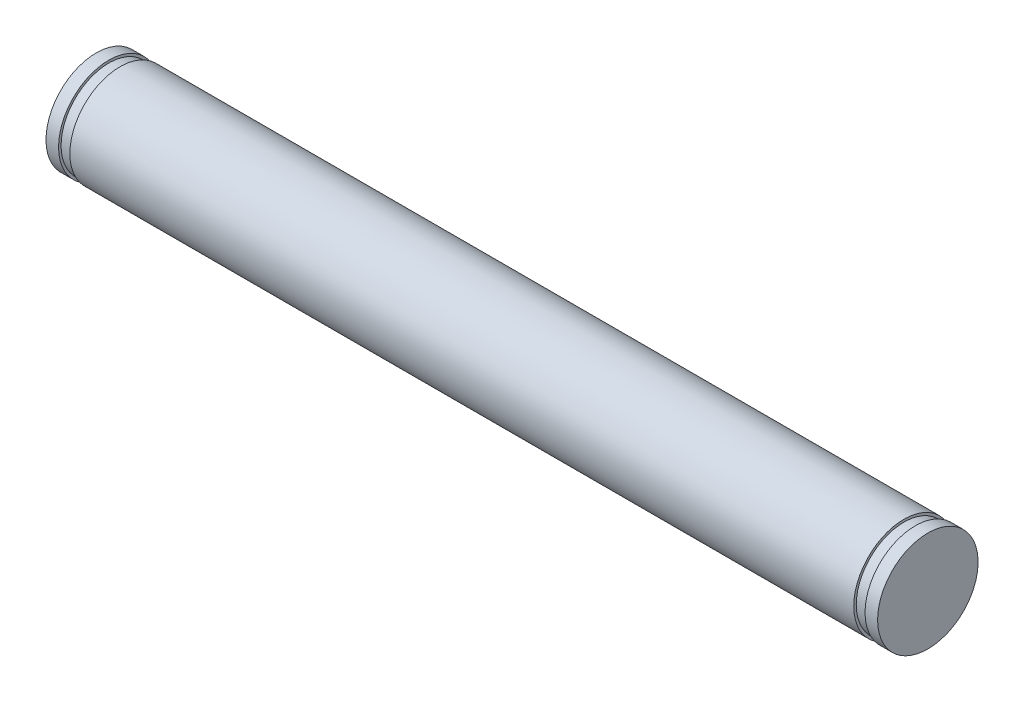
ISO-10303-21;
HEADER;
FILE_DESCRIPTION(('STEP AP214'),'2;1');
FILE_NAME('part.step','',(''),(''),'','','');
FILE_SCHEMA(('AUTOMOTIVE_DESIGN { 1 0 10303 214 1 1 1 1 }'));
ENDSEC;
DATA;
#1=APPLICATION_CONTEXT('core data for automotive mechanical design processes');
#2=APPLICATION_PROTOCOL_DEFINITION('international standard','automotive_design',2000,#1);
#3=PRODUCT_CONTEXT('',#1,'mechanical');
#4=PRODUCT('Part','Part','',(#3));
#5=PRODUCT_RELATED_PRODUCT_CATEGORY('part','',(#4));
#6=PRODUCT_DEFINITION_FORMATION('','',#4);
#7=PRODUCT_DEFINITION_CONTEXT('part definition',#1,'design');
#8=PRODUCT_DEFINITION('design','',#6,#7);
#9=PRODUCT_DEFINITION_SHAPE('','',#8);
#10=(LENGTH_UNIT() NAMED_UNIT(*) SI_UNIT(.MILLI.,.METRE.));
#11=(NAMED_UNIT(*) PLANE_ANGLE_UNIT() SI_UNIT($,.RADIAN.));
#12=(NAMED_UNIT(*) SI_UNIT($,.STERADIAN.) SOLID_ANGLE_UNIT());
#13=UNCERTAINTY_MEASURE_WITH_UNIT(LENGTH_MEASURE(1.E-05),#10,'distance_accuracy_value','');
#14=(GEOMETRIC_REPRESENTATION_CONTEXT(3) GLOBAL_UNCERTAINTY_ASSIGNED_CONTEXT((#13)) GLOBAL_UNIT_ASSIGNED_CONTEXT((#10,
#11,#12)) REPRESENTATION_CONTEXT('',''));
#15=CARTESIAN_POINT('',(0.,0.,0.));
#16=DIRECTION('',(0.,0.,1.));
#17=DIRECTION('',(1.,0.,0.));
#18=AXIS2_PLACEMENT_3D('',#15,#16,#17);
#19=CARTESIAN_POINT('',(-1.9,0.,0.));
#20=DIRECTION('',(1.,0.,0.));
#21=DIRECTION('',(0.,0.,-1.));
#22=AXIS2_PLACEMENT_3D('',#19,#20,#21);
#23=PLANE('',#22);
#24=CARTESIAN_POINT('',(-1.9,0.,0.));
#25=DIRECTION('',(-1.,0.,0.));
#26=DIRECTION('',(0.,0.,1.));
#27=AXIS2_PLACEMENT_3D('',#24,#25,#26);
#28=CIRCLE('',#27,4.);
#29=CARTESIAN_POINT('',(-1.9,0.,4.));
#30=VERTEX_POINT('',#29);
#31=EDGE_CURVE('E69',#30,#30,#28,.T.);
#32=ORIENTED_EDGE('',*,*,#31,.T.);
#33=EDGE_LOOP('',(#32));
#34=FACE_BOUND('',#33,.T.);
#35=ADVANCED_FACE('F34',(#34),#23,.F.);
#36=CARTESIAN_POINT('',(64.3,0.,0.));
#37=DIRECTION('',(1.,0.,0.));
#38=DIRECTION('',(0.,0.,-1.));
#39=AXIS2_PLACEMENT_3D('',#36,#37,#38);
#40=PLANE('',#39);
#41=CARTESIAN_POINT('',(64.3,0.,0.));
#42=DIRECTION('',(-1.,0.,0.));
#43=DIRECTION('',(0.,0.,1.));
#44=AXIS2_PLACEMENT_3D('',#41,#42,#43);
#45=CIRCLE('',#44,4.);
#46=CARTESIAN_POINT('',(64.3,0.,4.));
#47=VERTEX_POINT('',#46);
#48=EDGE_CURVE('E10',#47,#47,#45,.T.);
#49=ORIENTED_EDGE('',*,*,#48,.F.);
#50=EDGE_LOOP('',(#49));
#51=FACE_BOUND('',#50,.T.);
#52=ADVANCED_FACE('F135',(#51),#40,.T.);
#53=CARTESIAN_POINT('',(0.,0.,0.));
#54=DIRECTION('',(-1.,0.,0.));
#55=DIRECTION('',(0.,0.,1.));
#56=AXIS2_PLACEMENT_3D('',#53,#54,#55);
#57=CYLINDRICAL_SURFACE('',#56,4.);
#58=ORIENTED_EDGE('',*,*,#48,.T.);
#59=EDGE_LOOP('',(#58));
#60=FACE_BOUND('',#59,.T.);
#61=CARTESIAN_POINT('',(63.3,0.,0.));
#62=DIRECTION('',(-1.,0.,0.));
#63=DIRECTION('',(0.,0.,1.));
#64=AXIS2_PLACEMENT_3D('',#61,#62,#63);
#65=CIRCLE('',#64,4.);
#66=CARTESIAN_POINT('',(63.3,0.,4.));
#67=VERTEX_POINT('',#66);
#68=EDGE_CURVE('E41',#67,#67,#65,.T.);
#69=ORIENTED_EDGE('',*,*,#68,.F.);
#70=EDGE_LOOP('',(#69));
#71=FACE_BOUND('',#70,.T.);
#72=ADVANCED_FACE('F133',(#60,#71),#57,.T.);
#73=CARTESIAN_POINT('',(63.3,0.,0.));
#74=DIRECTION('',(-1.,0.,0.));
#75=DIRECTION('',(0.,0.,1.));
#76=AXIS2_PLACEMENT_3D('',#73,#74,#75);
#77=PLANE('',#76);
#78=ORIENTED_EDGE('',*,*,#68,.T.);
#79=EDGE_LOOP('',(#78));
#80=FACE_BOUND('',#79,.T.);
#81=CARTESIAN_POINT('',(63.3,0.,0.));
#82=DIRECTION('',(-1.,0.,0.));
#83=DIRECTION('',(0.,0.,1.));
#84=AXIS2_PLACEMENT_3D('',#81,#82,#83);
#85=CIRCLE('',#84,3.8);
#86=CARTESIAN_POINT('',(63.3,0.,3.8));
#87=VERTEX_POINT('',#86);
#88=EDGE_CURVE('E45',#87,#87,#85,.T.);
#89=ORIENTED_EDGE('',*,*,#88,.F.);
#90=EDGE_LOOP('',(#89));
#91=FACE_BOUND('',#90,.T.);
#92=ADVANCED_FACE('F129',(#80,#91),#77,.T.);
#93=CARTESIAN_POINT('',(0.,0.,0.));
#94=DIRECTION('',(-1.,0.,0.));
#95=DIRECTION('',(0.,0.,1.));
#96=AXIS2_PLACEMENT_3D('',#93,#94,#95);
#97=CYLINDRICAL_SURFACE('',#96,3.8);
#98=ORIENTED_EDGE('',*,*,#88,.T.);
#99=EDGE_LOOP('',(#98));
#100=FACE_BOUND('',#99,.T.);
#101=CARTESIAN_POINT('',(62.4,0.,0.));
#102=DIRECTION('',(-1.,0.,0.));
#103=DIRECTION('',(0.,0.,1.));
#104=AXIS2_PLACEMENT_3D('',#101,#102,#103);
#105=CIRCLE('',#104,3.8);
#106=CARTESIAN_POINT('',(62.4,0.,3.8));
#107=VERTEX_POINT('',#106);
#108=EDGE_CURVE('E49',#107,#107,#105,.T.);
#109=ORIENTED_EDGE('',*,*,#108,.F.);
#110=EDGE_LOOP('',(#109));
#111=FACE_BOUND('',#110,.T.);
#112=ADVANCED_FACE('F125',(#100,#111),#97,.T.);
#113=CARTESIAN_POINT('',(62.4,0.,0.));
#114=DIRECTION('',(-1.,0.,0.));
#115=DIRECTION('',(0.,0.,1.));
#116=AXIS2_PLACEMENT_3D('',#113,#114,#115);
#117=PLANE('',#116);
#118=CARTESIAN_POINT('',(62.4,0.,0.));
#119=DIRECTION('',(-1.,0.,0.));
#120=DIRECTION('',(0.,0.,1.));
#121=AXIS2_PLACEMENT_3D('',#118,#119,#120);
#122=CIRCLE('',#121,4.);
#123=CARTESIAN_POINT('',(62.4,0.,4.));
#124=VERTEX_POINT('',#123);
#125=EDGE_CURVE('E54',#124,#124,#122,.T.);
#126=ORIENTED_EDGE('',*,*,#125,.F.);
#127=EDGE_LOOP('',(#126));
#128=FACE_BOUND('',#127,.T.);
#129=ORIENTED_EDGE('',*,*,#108,.T.);
#130=EDGE_LOOP('',(#129));
#131=FACE_BOUND('',#130,.T.);
#132=ADVANCED_FACE('F121',(#128,#131),#117,.F.);
#133=CARTESIAN_POINT('',(0.,0.,0.));
#134=DIRECTION('',(-1.,0.,0.));
#135=DIRECTION('',(0.,0.,1.));
#136=AXIS2_PLACEMENT_3D('',#133,#134,#135);
#137=CYLINDRICAL_SURFACE('',#136,4.);
#138=ORIENTED_EDGE('',*,*,#125,.T.);
#139=EDGE_LOOP('',(#138));
#140=FACE_BOUND('',#139,.T.);
#141=CARTESIAN_POINT('',(0.,0.,0.));
#142=DIRECTION('',(-1.,0.,0.));
#143=DIRECTION('',(0.,0.,1.));
#144=AXIS2_PLACEMENT_3D('',#141,#142,#143);
#145=CIRCLE('',#144,4.);
#146=CARTESIAN_POINT('',(0.,0.,4.));
#147=VERTEX_POINT('',#146);
#148=EDGE_CURVE('E57',#147,#147,#145,.T.);
#149=ORIENTED_EDGE('',*,*,#148,.F.);
#150=EDGE_LOOP('',(#149));
#151=FACE_BOUND('',#150,.T.);
#152=ADVANCED_FACE('F117',(#140,#151),#137,.T.);
#153=CARTESIAN_POINT('',(0.,0.,0.));
#154=DIRECTION('',(-1.,0.,0.));
#155=DIRECTION('',(0.,0.,1.));
#156=AXIS2_PLACEMENT_3D('',#153,#154,#155);
#157=PLANE('',#156);
#158=ORIENTED_EDGE('',*,*,#148,.T.);
#159=EDGE_LOOP('',(#158));
#160=FACE_BOUND('',#159,.T.);
#161=CARTESIAN_POINT('',(0.,0.,0.));
#162=DIRECTION('',(-1.,0.,0.));
#163=DIRECTION('',(0.,0.,1.));
#164=AXIS2_PLACEMENT_3D('',#161,#162,#163);
#165=CIRCLE('',#164,3.8);
#166=CARTESIAN_POINT('',(0.,0.,3.8));
#167=VERTEX_POINT('',#166);
#168=EDGE_CURVE('E60',#167,#167,#165,.T.);
#169=ORIENTED_EDGE('',*,*,#168,.F.);
#170=EDGE_LOOP('',(#169));
#171=FACE_BOUND('',#170,.T.);
#172=ADVANCED_FACE('F113',(#160,#171),#157,.T.);
#173=CARTESIAN_POINT('',(0.,0.,0.));
#174=DIRECTION('',(-1.,0.,0.));
#175=DIRECTION('',(0.,0.,1.));
#176=AXIS2_PLACEMENT_3D('',#173,#174,#175);
#177=CYLINDRICAL_SURFACE('',#176,3.8);
#178=CARTESIAN_POINT('',(-0.9,0.,0.));
#179=DIRECTION('',(-1.,0.,0.));
#180=DIRECTION('',(0.,0.,1.));
#181=AXIS2_PLACEMENT_3D('',#178,#179,#180);
#182=CIRCLE('',#181,3.8);
#183=CARTESIAN_POINT('',(-0.9,0.,3.8));
#184=VERTEX_POINT('',#183);
#185=EDGE_CURVE('E63',#184,#184,#182,.T.);
#186=ORIENTED_EDGE('',*,*,#185,.F.);
#187=EDGE_LOOP('',(#186));
#188=FACE_BOUND('',#187,.T.);
#189=ORIENTED_EDGE('',*,*,#168,.T.);
#190=EDGE_LOOP('',(#189));
#191=FACE_BOUND('',#190,.T.);
#192=ADVANCED_FACE('F109',(#188,#191),#177,.T.);
#193=CARTESIAN_POINT('',(-0.9,0.,0.));
#194=DIRECTION('',(-1.,0.,0.));
#195=DIRECTION('',(0.,0.,1.));
#196=AXIS2_PLACEMENT_3D('',#193,#194,#195);
#197=PLANE('',#196);
#198=CARTESIAN_POINT('',(-0.9,0.,0.));
#199=DIRECTION('',(-1.,0.,0.));
#200=DIRECTION('',(0.,0.,1.));
#201=AXIS2_PLACEMENT_3D('',#198,#199,#200);
#202=CIRCLE('',#201,4.);
#203=CARTESIAN_POINT('',(-0.9,0.,4.));
#204=VERTEX_POINT('',#203);
#205=EDGE_CURVE('E66',#204,#204,#202,.T.);
#206=ORIENTED_EDGE('',*,*,#205,.F.);
#207=EDGE_LOOP('',(#206));
#208=FACE_BOUND('',#207,.T.);
#209=ORIENTED_EDGE('',*,*,#185,.T.);
#210=EDGE_LOOP('',(#209));
#211=FACE_BOUND('',#210,.T.);
#212=ADVANCED_FACE('F105',(#208,#211),#197,.F.);
#213=CARTESIAN_POINT('',(0.,0.,0.));
#214=DIRECTION('',(-1.,0.,0.));
#215=DIRECTION('',(0.,0.,1.));
#216=AXIS2_PLACEMENT_3D('',#213,#214,#215);
#217=CYLINDRICAL_SURFACE('',#216,4.);
#218=ORIENTED_EDGE('',*,*,#31,.F.);
#219=EDGE_LOOP('',(#218));
#220=FACE_BOUND('',#219,.T.);
#221=ORIENTED_EDGE('',*,*,#205,.T.);
#222=EDGE_LOOP('',(#221));
#223=FACE_BOUND('',#222,.T.);
#224=ADVANCED_FACE('F103',(#220,#223),#217,.T.);
#225=CLOSED_SHELL('',(#35,#52,#72,#92,#112,#132,#152,#172,#192,#212,#224));
#226=CARTESIAN_POINT('',(62.4,0.,0.));
#227=DIRECTION('',(-1.,0.,0.));
#228=DIRECTION('',(0.,0.,1.));
#229=AXIS2_PLACEMENT_3D('',#226,#227,#228);
#230=PLANE('',#229);
#231=CARTESIAN_POINT('',(62.4,0.,0.));
#232=DIRECTION('',(-1.,0.,0.));
#233=DIRECTION('',(0.,0.,1.));
#234=AXIS2_PLACEMENT_3D('',#231,#232,#233);
#235=CIRCLE('',#234,1.78150672782901);
#236=CARTESIAN_POINT('',(62.4,0.,1.78150672782901));
#237=VERTEX_POINT('',#236);
#238=EDGE_CURVE('E78',#237,#237,#235,.T.);
#239=ORIENTED_EDGE('',*,*,#238,.T.);
#240=EDGE_LOOP('',(#239));
#241=FACE_BOUND('',#240,.T.);
#242=CARTESIAN_POINT('',(62.4,0.,0.));
#243=DIRECTION('',(-1.,0.,0.));
#244=DIRECTION('',(0.,0.,1.));
#245=AXIS2_PLACEMENT_3D('',#242,#243,#244);
#246=CIRCLE('',#245,1.68057150333984);
#247=CARTESIAN_POINT('',(62.4,0.,1.68057150333984));
#248=VERTEX_POINT('',#247);
#249=EDGE_CURVE('E72',#248,#248,#246,.T.);
#250=ORIENTED_EDGE('',*,*,#249,.F.);
#251=EDGE_LOOP('',(#250));
#252=FACE_BOUND('',#251,.T.);
#253=ADVANCED_FACE('F82',(#241,#252),#230,.T.);
#254=CARTESIAN_POINT('',(62.4,0.,0.));
#255=DIRECTION('',(-1.,0.,0.));
#256=DIRECTION('',(0.,0.,1.));
#257=AXIS2_PLACEMENT_3D('',#254,#255,#256);
#258=CONICAL_SURFACE('',#257,1.68057150333984,0.349897397677372);
#259=CARTESIAN_POINT('',(62.1233986218421,0.,0.));
#260=DIRECTION('',(-1.,0.,0.));
#261=DIRECTION('',(0.,0.,1.));
#262=AXIS2_PLACEMENT_3D('',#259,#260,#261);
#263=CIRCLE('',#262,1.78150672782901);
#264=CARTESIAN_POINT('',(62.1233986218421,0.,1.78150672782901));
#265=VERTEX_POINT('',#264);
#266=EDGE_CURVE('E75',#265,#265,#263,.T.);
#267=ORIENTED_EDGE('',*,*,#266,.F.);
#268=EDGE_LOOP('',(#267));
#269=FACE_BOUND('',#268,.T.);
#270=ORIENTED_EDGE('',*,*,#249,.T.);
#271=EDGE_LOOP('',(#270));
#272=FACE_BOUND('',#271,.T.);
#273=ADVANCED_FACE('F88',(#269,#272),#258,.T.);
#274=CARTESIAN_POINT('',(0.,0.,0.));
#275=DIRECTION('',(-1.,0.,0.));
#276=DIRECTION('',(0.,0.,1.));
#277=AXIS2_PLACEMENT_3D('',#274,#275,#276);
#278=CYLINDRICAL_SURFACE('',#277,1.78150672782901);
#279=ORIENTED_EDGE('',*,*,#238,.F.);
#280=EDGE_LOOP('',(#279));
#281=FACE_BOUND('',#280,.T.);
#282=ORIENTED_EDGE('',*,*,#266,.T.);
#283=EDGE_LOOP('',(#282));
#284=FACE_BOUND('',#283,.T.);
#285=ADVANCED_FACE('F85',(#281,#284),#278,.F.);
#286=CLOSED_SHELL('',(#253,#273,#285));
#287=ORIENTED_CLOSED_SHELL('',*,#286,.T.);
#288=BREP_WITH_VOIDS('B2',#225,(#287));
#289=ADVANCED_BREP_SHAPE_REPRESENTATION('',(#18,#288),#14);
#290=SHAPE_DEFINITION_REPRESENTATION(#9,#289);
ENDSEC;
END-ISO-10303-21;
